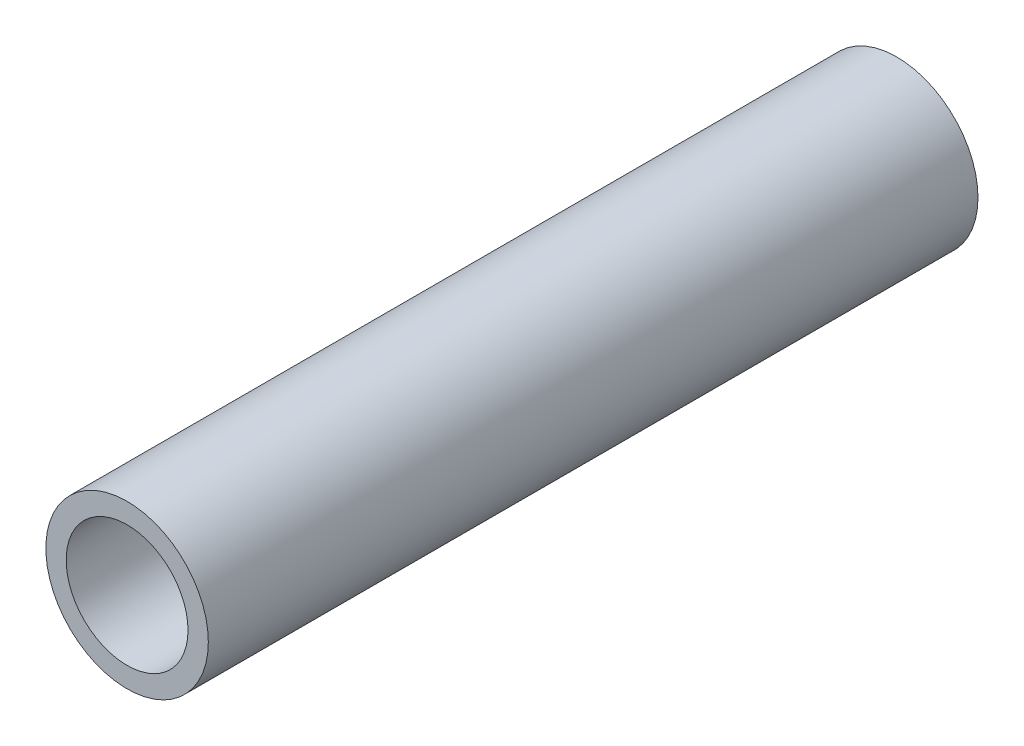
ISO-10303-21;
HEADER;
FILE_DESCRIPTION(('STEP AP214'),'2;1');
FILE_NAME('part.step','',(''),(''),'','','');
FILE_SCHEMA(('AUTOMOTIVE_DESIGN { 1 0 10303 214 1 1 1 1 }'));
ENDSEC;
DATA;
#1=APPLICATION_CONTEXT('core data for automotive mechanical design processes');
#2=APPLICATION_PROTOCOL_DEFINITION('international standard','automotive_design',2000,#1);
#3=PRODUCT_CONTEXT('',#1,'mechanical');
#4=PRODUCT('Part','Part','',(#3));
#5=PRODUCT_RELATED_PRODUCT_CATEGORY('part','',(#4));
#6=PRODUCT_DEFINITION_FORMATION('','',#4);
#7=PRODUCT_DEFINITION_CONTEXT('part definition',#1,'design');
#8=PRODUCT_DEFINITION('design','',#6,#7);
#9=PRODUCT_DEFINITION_SHAPE('','',#8);
#10=(LENGTH_UNIT() NAMED_UNIT(*) SI_UNIT(.MILLI.,.METRE.));
#11=(NAMED_UNIT(*) PLANE_ANGLE_UNIT() SI_UNIT($,.RADIAN.));
#12=(NAMED_UNIT(*) SI_UNIT($,.STERADIAN.) SOLID_ANGLE_UNIT());
#13=UNCERTAINTY_MEASURE_WITH_UNIT(LENGTH_MEASURE(1.E-05),#10,'distance_accuracy_value','');
#14=(GEOMETRIC_REPRESENTATION_CONTEXT(3) GLOBAL_UNCERTAINTY_ASSIGNED_CONTEXT((#13)) GLOBAL_UNIT_ASSIGNED_CONTEXT((#10,
#11,#12)) REPRESENTATION_CONTEXT('',''));
#15=CARTESIAN_POINT('',(0.,0.,0.));
#16=DIRECTION('',(0.,0.,1.));
#17=DIRECTION('',(1.,0.,0.));
#18=AXIS2_PLACEMENT_3D('',#15,#16,#17);
#19=CARTESIAN_POINT('',(0.,0.,189.48));
#20=DIRECTION('',(0.,0.,-1.));
#21=DIRECTION('',(-1.,0.,0.));
#22=AXIS2_PLACEMENT_3D('',#19,#20,#21);
#23=CYLINDRICAL_SURFACE('',#22,20.);
#24=CARTESIAN_POINT('',(0.,0.,189.48));
#25=DIRECTION('',(0.,0.,1.));
#26=DIRECTION('',(1.,0.,0.));
#27=AXIS2_PLACEMENT_3D('',#24,#25,#26);
#28=CIRCLE('',#27,20.);
#29=CARTESIAN_POINT('',(20.,0.,189.48));
#30=VERTEX_POINT('',#29);
#31=EDGE_CURVE('E10',#30,#30,#28,.T.);
#32=ORIENTED_EDGE('',*,*,#31,.F.);
#33=EDGE_LOOP('',(#32));
#34=FACE_BOUND('',#33,.T.);
#35=CARTESIAN_POINT('',(0.,0.,0.));
#36=DIRECTION('',(0.,0.,1.));
#37=DIRECTION('',(1.,0.,0.));
#38=AXIS2_PLACEMENT_3D('',#35,#36,#37);
#39=CIRCLE('',#38,20.);
#40=CARTESIAN_POINT('',(20.,0.,0.));
#41=VERTEX_POINT('',#40);
#42=EDGE_CURVE('E46',#41,#41,#39,.T.);
#43=ORIENTED_EDGE('',*,*,#42,.T.);
#44=EDGE_LOOP('',(#43));
#45=FACE_BOUND('',#44,.T.);
#46=ADVANCED_FACE('F43',(#34,#45),#23,.T.);
#47=CARTESIAN_POINT('',(0.,0.,189.48));
#48=DIRECTION('',(0.,0.,1.));
#49=DIRECTION('',(1.,0.,0.));
#50=AXIS2_PLACEMENT_3D('',#47,#48,#49);
#51=PLANE('',#50);
#52=CARTESIAN_POINT('',(0.,0.,189.48));
#53=DIRECTION('',(0.,0.,1.));
#54=DIRECTION('',(1.,0.,0.));
#55=AXIS2_PLACEMENT_3D('',#52,#53,#54);
#56=CIRCLE('',#55,15.);
#57=CARTESIAN_POINT('',(15.,0.,189.48));
#58=VERTEX_POINT('',#57);
#59=EDGE_CURVE('E57',#58,#58,#56,.T.);
#60=ORIENTED_EDGE('',*,*,#59,.F.);
#61=EDGE_LOOP('',(#60));
#62=FACE_BOUND('',#61,.T.);
#63=ORIENTED_EDGE('',*,*,#31,.T.);
#64=EDGE_LOOP('',(#63));
#65=FACE_BOUND('',#64,.T.);
#66=ADVANCED_FACE('F74',(#62,#65),#51,.T.);
#67=CARTESIAN_POINT('',(0.,0.,0.));
#68=DIRECTION('',(0.,0.,1.));
#69=DIRECTION('',(1.,0.,0.));
#70=AXIS2_PLACEMENT_3D('',#67,#68,#69);
#71=PLANE('',#70);
#72=CARTESIAN_POINT('',(0.,0.,0.));
#73=DIRECTION('',(0.,0.,1.));
#74=DIRECTION('',(1.,0.,0.));
#75=AXIS2_PLACEMENT_3D('',#72,#73,#74);
#76=CIRCLE('',#75,15.);
#77=CARTESIAN_POINT('',(15.,0.,0.));
#78=VERTEX_POINT('',#77);
#79=EDGE_CURVE('E55',#78,#78,#76,.T.);
#80=ORIENTED_EDGE('',*,*,#79,.T.);
#81=EDGE_LOOP('',(#80));
#82=FACE_BOUND('',#81,.T.);
#83=ORIENTED_EDGE('',*,*,#42,.F.);
#84=EDGE_LOOP('',(#83));
#85=FACE_BOUND('',#84,.T.);
#86=ADVANCED_FACE('F65',(#82,#85),#71,.F.);
#87=CARTESIAN_POINT('',(0.,0.,0.));
#88=DIRECTION('',(0.,0.,1.));
#89=DIRECTION('',(1.,0.,0.));
#90=AXIS2_PLACEMENT_3D('',#87,#88,#89);
#91=CYLINDRICAL_SURFACE('',#90,15.);
#92=ORIENTED_EDGE('',*,*,#79,.F.);
#93=EDGE_LOOP('',(#92));
#94=FACE_BOUND('',#93,.T.);
#95=ORIENTED_EDGE('',*,*,#59,.T.);
#96=EDGE_LOOP('',(#95));
#97=FACE_BOUND('',#96,.T.);
#98=ADVANCED_FACE('F68',(#94,#97),#91,.F.);
#99=CLOSED_SHELL('',(#46,#66,#86,#98));
#100=MANIFOLD_SOLID_BREP('B2',#99);
#101=ADVANCED_BREP_SHAPE_REPRESENTATION('',(#18,#100),#14);
#102=SHAPE_DEFINITION_REPRESENTATION(#9,#101);
ENDSEC;
END-ISO-10303-21;
